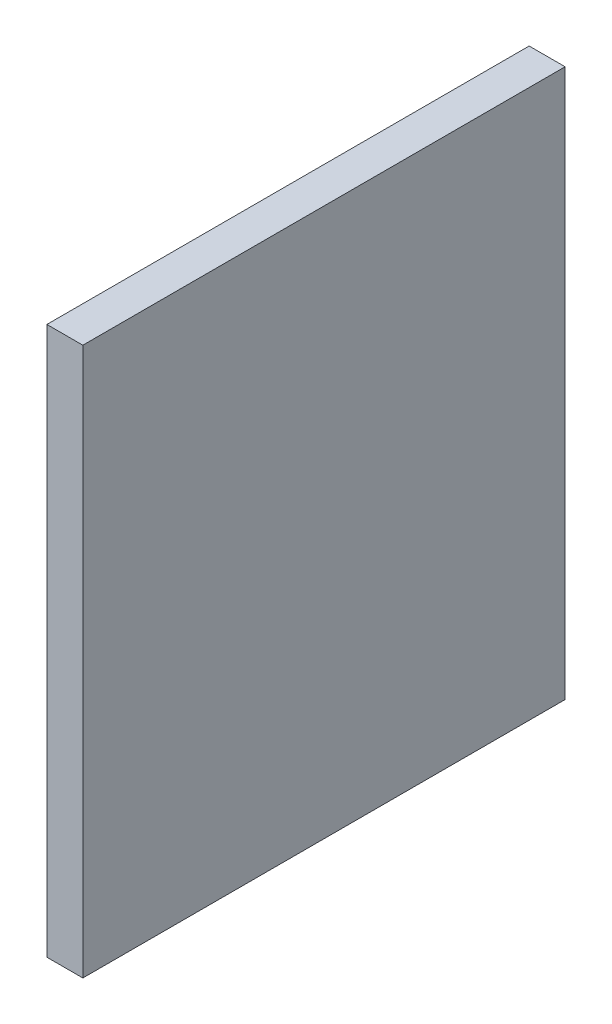
ISO-10303-21;
HEADER;
FILE_DESCRIPTION(('STEP AP214'),'2;1');
FILE_NAME('part.step','',(''),(''),'','','');
FILE_SCHEMA(('AUTOMOTIVE_DESIGN { 1 0 10303 214 1 1 1 1 }'));
ENDSEC;
DATA;
#1=APPLICATION_CONTEXT('core data for automotive mechanical design processes');
#2=APPLICATION_PROTOCOL_DEFINITION('international standard','automotive_design',2000,#1);
#3=PRODUCT_CONTEXT('',#1,'mechanical');
#4=PRODUCT('Part','Part','',(#3));
#5=PRODUCT_RELATED_PRODUCT_CATEGORY('part','',(#4));
#6=PRODUCT_DEFINITION_FORMATION('','',#4);
#7=PRODUCT_DEFINITION_CONTEXT('part definition',#1,'design');
#8=PRODUCT_DEFINITION('design','',#6,#7);
#9=PRODUCT_DEFINITION_SHAPE('','',#8);
#10=(LENGTH_UNIT() NAMED_UNIT(*) SI_UNIT(.MILLI.,.METRE.));
#11=(NAMED_UNIT(*) PLANE_ANGLE_UNIT() SI_UNIT($,.RADIAN.));
#12=(NAMED_UNIT(*) SI_UNIT($,.STERADIAN.) SOLID_ANGLE_UNIT());
#13=UNCERTAINTY_MEASURE_WITH_UNIT(LENGTH_MEASURE(1.E-05),#10,'distance_accuracy_value','');
#14=(GEOMETRIC_REPRESENTATION_CONTEXT(3) GLOBAL_UNCERTAINTY_ASSIGNED_CONTEXT((#13)) GLOBAL_UNIT_ASSIGNED_CONTEXT((#10,
#11,#12)) REPRESENTATION_CONTEXT('',''));
#15=CARTESIAN_POINT('',(0.,0.,0.));
#16=DIRECTION('',(0.,0.,1.));
#17=DIRECTION('',(1.,0.,0.));
#18=AXIS2_PLACEMENT_3D('',#15,#16,#17);
#19=CARTESIAN_POINT('',(5.,38.1940740740741,10.9753086419753));
#20=DIRECTION('',(0.,0.,-1.));
#21=DIRECTION('',(0.,1.,0.));
#22=AXIS2_PLACEMENT_3D('',#19,#20,#21);
#23=PLANE('',#22);
#24=DIRECTION('',(0.,-1.,0.));
#25=VECTOR('',#24,1.);
#26=CARTESIAN_POINT('',(0.,38.1940740740741,10.9753086419753));
#27=LINE('',#26,#25);
#28=CARTESIAN_POINT('',(0.,38.1940740740741,10.9753086419753));
#29=VERTEX_POINT('',#28);
#30=CARTESIAN_POINT('',(0.,-38.0059259259259,10.9753086419753));
#31=VERTEX_POINT('',#30);
#32=EDGE_CURVE('E107',#29,#31,#27,.T.);
#33=ORIENTED_EDGE('',*,*,#32,.T.);
#34=DIRECTION('',(-1.,0.,0.));
#35=VECTOR('',#34,1.);
#36=CARTESIAN_POINT('',(5.,-38.0059259259259,10.9753086419753));
#37=LINE('',#36,#35);
#38=CARTESIAN_POINT('',(5.,-38.0059259259259,10.9753086419753));
#39=VERTEX_POINT('',#38);
#40=EDGE_CURVE('E11',#39,#31,#37,.T.);
#41=ORIENTED_EDGE('',*,*,#40,.F.);
#42=DIRECTION('',(0.,-1.,0.));
#43=VECTOR('',#42,1.);
#44=CARTESIAN_POINT('',(5.,38.1940740740741,10.9753086419753));
#45=LINE('',#44,#43);
#46=CARTESIAN_POINT('',(5.,38.1940740740741,10.9753086419753));
#47=VERTEX_POINT('',#46);
#48=EDGE_CURVE('E91',#47,#39,#45,.T.);
#49=ORIENTED_EDGE('',*,*,#48,.F.);
#50=DIRECTION('',(-1.,0.,0.));
#51=VECTOR('',#50,1.);
#52=CARTESIAN_POINT('',(5.,38.1940740740741,10.9753086419753));
#53=LINE('',#52,#51);
#54=EDGE_CURVE('E103',#47,#29,#53,.T.);
#55=ORIENTED_EDGE('',*,*,#54,.T.);
#56=EDGE_LOOP('',(#33,#41,#49,#55));
#57=FACE_BOUND('',#56,.T.);
#58=ADVANCED_FACE('F39',(#57),#23,.F.);
#59=CARTESIAN_POINT('',(5.,-38.0059259259259,10.9753086419753));
#60=DIRECTION('',(0.,1.,0.));
#61=DIRECTION('',(0.,0.,1.));
#62=AXIS2_PLACEMENT_3D('',#59,#60,#61);
#63=PLANE('',#62);
#64=DIRECTION('',(0.,0.,-1.));
#65=VECTOR('',#64,1.);
#66=CARTESIAN_POINT('',(0.,-38.0059259259259,10.9753086419753));
#67=LINE('',#66,#65);
#68=CARTESIAN_POINT('',(0.,-38.0059259259259,-56.0806913580248));
#69=VERTEX_POINT('',#68);
#70=EDGE_CURVE('E96',#31,#69,#67,.T.);
#71=ORIENTED_EDGE('',*,*,#70,.T.);
#72=DIRECTION('',(-1.,0.,0.));
#73=VECTOR('',#72,1.);
#74=CARTESIAN_POINT('',(5.,-38.0059259259259,-56.0806913580248));
#75=LINE('',#74,#73);
#76=CARTESIAN_POINT('',(5.,-38.0059259259259,-56.0806913580248));
#77=VERTEX_POINT('',#76);
#78=EDGE_CURVE('E48',#77,#69,#75,.T.);
#79=ORIENTED_EDGE('',*,*,#78,.F.);
#80=DIRECTION('',(0.,0.,-1.));
#81=VECTOR('',#80,1.);
#82=CARTESIAN_POINT('',(5.,-38.0059259259259,10.9753086419753));
#83=LINE('',#82,#81);
#84=EDGE_CURVE('E86',#39,#77,#83,.T.);
#85=ORIENTED_EDGE('',*,*,#84,.F.);
#86=ORIENTED_EDGE('',*,*,#40,.T.);
#87=EDGE_LOOP('',(#71,#79,#85,#86));
#88=FACE_BOUND('',#87,.T.);
#89=ADVANCED_FACE('F95',(#88),#63,.F.);
#90=CARTESIAN_POINT('',(5.,38.1940740740741,-56.0806913580247));
#91=DIRECTION('',(0.,0.,1.));
#92=DIRECTION('',(0.,-1.,0.));
#93=AXIS2_PLACEMENT_3D('',#90,#91,#92);
#94=PLANE('',#93);
#95=DIRECTION('',(0.,1.,0.));
#96=VECTOR('',#95,1.);
#97=CARTESIAN_POINT('',(0.,38.1940740740741,-56.0806913580247));
#98=LINE('',#97,#96);
#99=CARTESIAN_POINT('',(0.,38.1940740740741,-56.0806913580247));
#100=VERTEX_POINT('',#99);
#101=EDGE_CURVE('E73',#69,#100,#98,.T.);
#102=ORIENTED_EDGE('',*,*,#101,.T.);
#103=DIRECTION('',(-1.,0.,0.));
#104=VECTOR('',#103,1.);
#105=CARTESIAN_POINT('',(5.,38.1940740740741,-56.0806913580247));
#106=LINE('',#105,#104);
#107=CARTESIAN_POINT('',(5.,38.1940740740741,-56.0806913580247));
#108=VERTEX_POINT('',#107);
#109=EDGE_CURVE('E98',#108,#100,#106,.T.);
#110=ORIENTED_EDGE('',*,*,#109,.F.);
#111=DIRECTION('',(0.,1.,0.));
#112=VECTOR('',#111,1.);
#113=CARTESIAN_POINT('',(5.,38.1940740740741,-56.0806913580247));
#114=LINE('',#113,#112);
#115=EDGE_CURVE('E89',#77,#108,#114,.T.);
#116=ORIENTED_EDGE('',*,*,#115,.F.);
#117=ORIENTED_EDGE('',*,*,#78,.T.);
#118=EDGE_LOOP('',(#102,#110,#116,#117));
#119=FACE_BOUND('',#118,.T.);
#120=ADVANCED_FACE('F99',(#119),#94,.F.);
#121=CARTESIAN_POINT('',(5.,38.1940740740741,10.9753086419753));
#122=DIRECTION('',(0.,-1.,0.));
#123=DIRECTION('',(0.,0.,-1.));
#124=AXIS2_PLACEMENT_3D('',#121,#122,#123);
#125=PLANE('',#124);
#126=DIRECTION('',(0.,0.,1.));
#127=VECTOR('',#126,1.);
#128=CARTESIAN_POINT('',(0.,38.1940740740741,10.9753086419753));
#129=LINE('',#128,#127);
#130=EDGE_CURVE('E79',#100,#29,#129,.T.);
#131=ORIENTED_EDGE('',*,*,#130,.T.);
#132=ORIENTED_EDGE('',*,*,#54,.F.);
#133=DIRECTION('',(0.,0.,1.));
#134=VECTOR('',#133,1.);
#135=CARTESIAN_POINT('',(5.,38.1940740740741,10.9753086419753));
#136=LINE('',#135,#134);
#137=EDGE_CURVE('E56',#108,#47,#136,.T.);
#138=ORIENTED_EDGE('',*,*,#137,.F.);
#139=ORIENTED_EDGE('',*,*,#109,.T.);
#140=EDGE_LOOP('',(#131,#132,#138,#139));
#141=FACE_BOUND('',#140,.T.);
#142=ADVANCED_FACE('F120',(#141),#125,.F.);
#143=CARTESIAN_POINT('',(5.,0.,0.));
#144=DIRECTION('',(1.,0.,0.));
#145=DIRECTION('',(0.,0.,-1.));
#146=AXIS2_PLACEMENT_3D('',#143,#144,#145);
#147=PLANE('',#146);
#148=ORIENTED_EDGE('',*,*,#48,.T.);
#149=ORIENTED_EDGE('',*,*,#84,.T.);
#150=ORIENTED_EDGE('',*,*,#115,.T.);
#151=ORIENTED_EDGE('',*,*,#137,.T.);
#152=EDGE_LOOP('',(#148,#149,#150,#151));
#153=FACE_BOUND('',#152,.T.);
#154=ADVANCED_FACE('F87',(#153),#147,.T.);
#155=CARTESIAN_POINT('',(0.,0.,0.));
#156=DIRECTION('',(1.,0.,0.));
#157=DIRECTION('',(0.,0.,-1.));
#158=AXIS2_PLACEMENT_3D('',#155,#156,#157);
#159=PLANE('',#158);
#160=ORIENTED_EDGE('',*,*,#32,.F.);
#161=ORIENTED_EDGE('',*,*,#130,.F.);
#162=ORIENTED_EDGE('',*,*,#101,.F.);
#163=ORIENTED_EDGE('',*,*,#70,.F.);
#164=EDGE_LOOP('',(#160,#161,#162,#163));
#165=FACE_BOUND('',#164,.T.);
#166=ADVANCED_FACE('F123',(#165),#159,.F.);
#167=CLOSED_SHELL('',(#58,#89,#120,#142,#154,#166));
#168=MANIFOLD_SOLID_BREP('B2',#167);
#169=ADVANCED_BREP_SHAPE_REPRESENTATION('',(#18,#168),#14);
#170=SHAPE_DEFINITION_REPRESENTATION(#9,#169);
ENDSEC;
END-ISO-10303-21;
